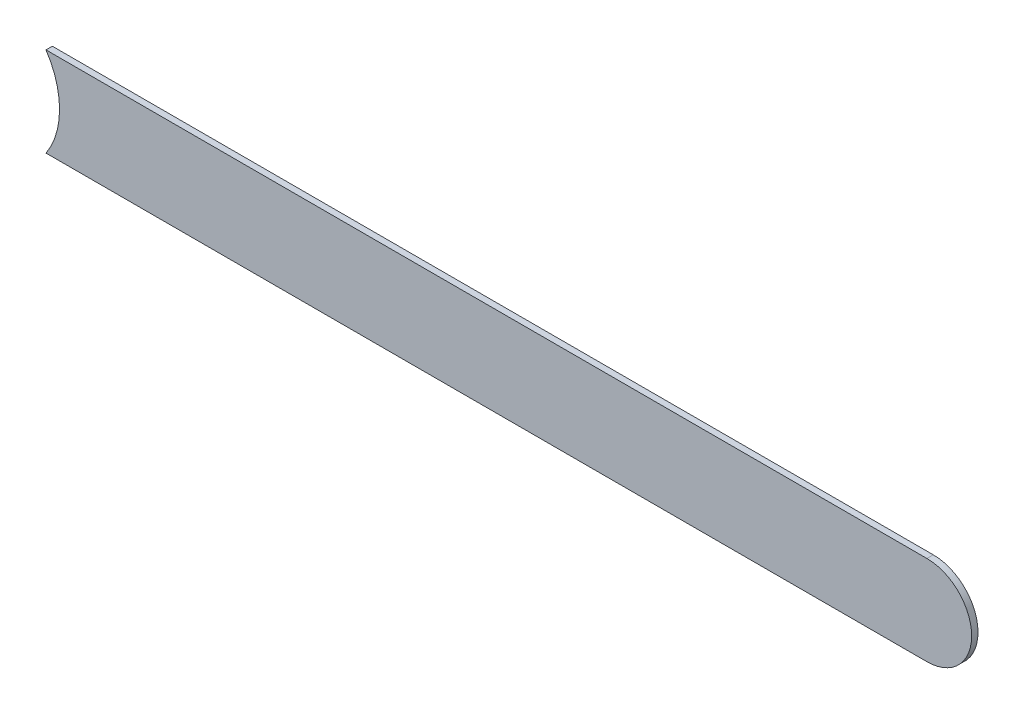
ISO-10303-21;
HEADER;
FILE_DESCRIPTION(('STEP AP214'),'2;1');
FILE_NAME('part.step','',(''),(''),'','','');
FILE_SCHEMA(('AUTOMOTIVE_DESIGN { 1 0 10303 214 1 1 1 1 }'));
ENDSEC;
DATA;
#1=APPLICATION_CONTEXT('core data for automotive mechanical design processes');
#2=APPLICATION_PROTOCOL_DEFINITION('international standard','automotive_design',2000,#1);
#3=PRODUCT_CONTEXT('',#1,'mechanical');
#4=PRODUCT('Part','Part','',(#3));
#5=PRODUCT_RELATED_PRODUCT_CATEGORY('part','',(#4));
#6=PRODUCT_DEFINITION_FORMATION('','',#4);
#7=PRODUCT_DEFINITION_CONTEXT('part definition',#1,'design');
#8=PRODUCT_DEFINITION('design','',#6,#7);
#9=PRODUCT_DEFINITION_SHAPE('','',#8);
#10=(LENGTH_UNIT() NAMED_UNIT(*) SI_UNIT(.MILLI.,.METRE.));
#11=(NAMED_UNIT(*) PLANE_ANGLE_UNIT() SI_UNIT($,.RADIAN.));
#12=(NAMED_UNIT(*) SI_UNIT($,.STERADIAN.) SOLID_ANGLE_UNIT());
#13=UNCERTAINTY_MEASURE_WITH_UNIT(LENGTH_MEASURE(1.E-05),#10,'distance_accuracy_value','');
#14=(GEOMETRIC_REPRESENTATION_CONTEXT(3) GLOBAL_UNCERTAINTY_ASSIGNED_CONTEXT((#13)) GLOBAL_UNIT_ASSIGNED_CONTEXT((#10,
#11,#12)) REPRESENTATION_CONTEXT('',''));
#15=CARTESIAN_POINT('',(0.,0.,0.));
#16=DIRECTION('',(0.,0.,1.));
#17=DIRECTION('',(1.,0.,0.));
#18=AXIS2_PLACEMENT_3D('',#15,#16,#17);
#19=CARTESIAN_POINT('',(51.0251685903459,111.6980113,0.));
#20=DIRECTION('',(0.,1.,0.));
#21=DIRECTION('',(1.,0.,0.));
#22=AXIS2_PLACEMENT_3D('',#19,#20,#21);
#23=PLANE('',#22);
#24=DIRECTION('',(1.,0.,0.));
#25=VECTOR('',#24,1.);
#26=CARTESIAN_POINT('',(50.6510036,111.6980113,0.03556));
#27=LINE('',#26,#25);
#28=CARTESIAN_POINT('',(51.0251685903459,111.6980113,0.03556));
#29=VERTEX_POINT('',#28);
#30=CARTESIAN_POINT('',(55.95198868,111.6980113,0.03556));
#31=VERTEX_POINT('',#30);
#32=EDGE_CURVE('E11',#29,#31,#27,.T.);
#33=ORIENTED_EDGE('',*,*,#32,.F.);
#34=DIRECTION('',(0.,0.,1.));
#35=VECTOR('',#34,1.);
#36=CARTESIAN_POINT('',(51.0251685903459,111.6980113,0.));
#37=LINE('',#36,#35);
#38=CARTESIAN_POINT('',(51.0251685903459,111.6980113,0.));
#39=VERTEX_POINT('',#38);
#40=EDGE_CURVE('E24',#39,#29,#37,.T.);
#41=ORIENTED_EDGE('',*,*,#40,.F.);
#42=DIRECTION('',(1.,0.,0.));
#43=VECTOR('',#42,1.);
#44=CARTESIAN_POINT('',(50.6510036,111.6980113,0.));
#45=LINE('',#44,#43);
#46=CARTESIAN_POINT('',(55.95198868,111.6980113,0.));
#47=VERTEX_POINT('',#46);
#48=EDGE_CURVE('E82',#39,#47,#45,.T.);
#49=ORIENTED_EDGE('',*,*,#48,.T.);
#50=DIRECTION('',(0.,0.,1.));
#51=VECTOR('',#50,1.);
#52=CARTESIAN_POINT('',(55.95198868,111.6980113,0.));
#53=LINE('',#52,#51);
#54=EDGE_CURVE('E37',#47,#31,#53,.T.);
#55=ORIENTED_EDGE('',*,*,#54,.T.);
#56=EDGE_LOOP('',(#33,#41,#49,#55));
#57=FACE_BOUND('',#56,.T.);
#58=ADVANCED_FACE('F17',(#57),#23,.F.);
#59=CARTESIAN_POINT('',(55.95198868,111.9480108,0.));
#60=DIRECTION('',(0.,0.,-1.));
#61=DIRECTION('',(0.,-1.,0.));
#62=AXIS2_PLACEMENT_3D('',#59,#60,#61);
#63=CYLINDRICAL_SURFACE('',#62,0.249999500000001);
#64=CARTESIAN_POINT('',(55.95198868,111.9480108,0.03556));
#65=DIRECTION('',(0.,0.,1.));
#66=DIRECTION('',(0.,-1.,0.));
#67=AXIS2_PLACEMENT_3D('',#64,#65,#66);
#68=CIRCLE('',#67,0.249999500000001);
#69=CARTESIAN_POINT('',(55.95198868,112.1980103,0.03556));
#70=VERTEX_POINT('',#69);
#71=EDGE_CURVE('E97',#31,#70,#68,.T.);
#72=ORIENTED_EDGE('',*,*,#71,.F.);
#73=ORIENTED_EDGE('',*,*,#54,.F.);
#74=CARTESIAN_POINT('',(55.95198868,111.9480108,0.));
#75=DIRECTION('',(0.,0.,1.));
#76=DIRECTION('',(0.,-1.,0.));
#77=AXIS2_PLACEMENT_3D('',#74,#75,#76);
#78=CIRCLE('',#77,0.249999500000001);
#79=CARTESIAN_POINT('',(55.95198868,112.1980103,0.));
#80=VERTEX_POINT('',#79);
#81=EDGE_CURVE('E94',#47,#80,#78,.T.);
#82=ORIENTED_EDGE('',*,*,#81,.T.);
#83=DIRECTION('',(0.,0.,1.));
#84=VECTOR('',#83,1.);
#85=CARTESIAN_POINT('',(55.95198868,112.1980103,0.));
#86=LINE('',#85,#84);
#87=EDGE_CURVE('E92',#80,#70,#86,.T.);
#88=ORIENTED_EDGE('',*,*,#87,.T.);
#89=EDGE_LOOP('',(#72,#73,#82,#88));
#90=FACE_BOUND('',#89,.T.);
#91=ADVANCED_FACE('F103',(#90),#63,.T.);
#92=CARTESIAN_POINT('',(55.95198868,112.1980103,0.));
#93=DIRECTION('',(0.,-1.,0.));
#94=DIRECTION('',(-1.,0.,0.));
#95=AXIS2_PLACEMENT_3D('',#92,#93,#94);
#96=PLANE('',#95);
#97=DIRECTION('',(-1.,0.,0.));
#98=VECTOR('',#97,1.);
#99=CARTESIAN_POINT('',(55.95198868,112.1980103,0.03556));
#100=LINE('',#99,#98);
#101=CARTESIAN_POINT('',(51.0251685903459,112.1980103,0.03556));
#102=VERTEX_POINT('',#101);
#103=EDGE_CURVE('E89',#70,#102,#100,.T.);
#104=ORIENTED_EDGE('',*,*,#103,.F.);
#105=ORIENTED_EDGE('',*,*,#87,.F.);
#106=DIRECTION('',(-1.,0.,0.));
#107=VECTOR('',#106,1.);
#108=CARTESIAN_POINT('',(55.95198868,112.1980103,0.));
#109=LINE('',#108,#107);
#110=CARTESIAN_POINT('',(51.0251685903459,112.1980103,0.));
#111=VERTEX_POINT('',#110);
#112=EDGE_CURVE('E87',#80,#111,#109,.T.);
#113=ORIENTED_EDGE('',*,*,#112,.T.);
#114=DIRECTION('',(0.,0.,1.));
#115=VECTOR('',#114,1.);
#116=CARTESIAN_POINT('',(51.0251685903459,112.1980103,0.));
#117=LINE('',#116,#115);
#118=EDGE_CURVE('E69',#111,#102,#117,.T.);
#119=ORIENTED_EDGE('',*,*,#118,.T.);
#120=EDGE_LOOP('',(#104,#105,#113,#119));
#121=FACE_BOUND('',#120,.T.);
#122=ADVANCED_FACE('F108',(#121),#96,.F.);
#123=CARTESIAN_POINT('',(50.6510036,111.9480108,0.));
#124=DIRECTION('',(0.,0.,-1.));
#125=DIRECTION('',(1.,0.,0.));
#126=AXIS2_PLACEMENT_3D('',#123,#124,#125);
#127=CYLINDRICAL_SURFACE('',#126,0.4499991);
#128=DIRECTION('',(0.,0.,1.));
#129=VECTOR('',#128,1.);
#130=CARTESIAN_POINT('',(51.1010027,111.9480108,0.));
#131=LINE('',#130,#129);
#132=CARTESIAN_POINT('',(51.1010027,111.9480108,0.));
#133=VERTEX_POINT('',#132);
#134=CARTESIAN_POINT('',(51.1010027,111.9480108,0.03556));
#135=VERTEX_POINT('',#134);
#136=EDGE_CURVE('E59',#133,#135,#131,.T.);
#137=ORIENTED_EDGE('',*,*,#136,.T.);
#138=CARTESIAN_POINT('',(50.6510036,111.9480108,0.03556));
#139=DIRECTION('',(0.,0.,1.));
#140=DIRECTION('',(1.,0.,0.));
#141=AXIS2_PLACEMENT_3D('',#138,#139,#140);
#142=CIRCLE('',#141,0.4499991);
#143=EDGE_CURVE('E70',#135,#102,#142,.T.);
#144=ORIENTED_EDGE('',*,*,#143,.T.);
#145=ORIENTED_EDGE('',*,*,#118,.F.);
#146=CARTESIAN_POINT('',(50.6510036,111.9480108,0.));
#147=DIRECTION('',(0.,0.,1.));
#148=DIRECTION('',(1.,0.,0.));
#149=AXIS2_PLACEMENT_3D('',#146,#147,#148);
#150=CIRCLE('',#149,0.4499991);
#151=EDGE_CURVE('E73',#133,#111,#150,.T.);
#152=ORIENTED_EDGE('',*,*,#151,.F.);
#153=EDGE_LOOP('',(#137,#144,#145,#152));
#154=FACE_BOUND('',#153,.T.);
#155=ADVANCED_FACE('F74',(#154),#127,.F.);
#156=CARTESIAN_POINT('',(50.6510036,111.9480108,0.));
#157=DIRECTION('',(0.,0.,-1.));
#158=DIRECTION('',(1.,0.,0.));
#159=AXIS2_PLACEMENT_3D('',#156,#157,#158);
#160=CYLINDRICAL_SURFACE('',#159,0.4499991);
#161=ORIENTED_EDGE('',*,*,#40,.T.);
#162=CARTESIAN_POINT('',(50.6510036,111.9480108,0.03556));
#163=DIRECTION('',(0.,0.,1.));
#164=DIRECTION('',(1.,0.,0.));
#165=AXIS2_PLACEMENT_3D('',#162,#163,#164);
#166=CIRCLE('',#165,0.4499991);
#167=EDGE_CURVE('E65',#29,#135,#166,.T.);
#168=ORIENTED_EDGE('',*,*,#167,.T.);
#169=ORIENTED_EDGE('',*,*,#136,.F.);
#170=EDGE_CURVE('E63',#39,#133,#150,.T.);
#171=ORIENTED_EDGE('',*,*,#170,.F.);
#172=EDGE_LOOP('',(#161,#168,#169,#171));
#173=FACE_BOUND('',#172,.T.);
#174=ADVANCED_FACE('F61',(#173),#160,.F.);
#175=CARTESIAN_POINT('',(50.6510036,111.6980113,0.));
#176=DIRECTION('',(0.,0.,-1.));
#177=DIRECTION('',(-1.,0.,0.));
#178=AXIS2_PLACEMENT_3D('',#175,#176,#177);
#179=PLANE('',#178);
#180=ORIENTED_EDGE('',*,*,#48,.F.);
#181=ORIENTED_EDGE('',*,*,#170,.T.);
#182=ORIENTED_EDGE('',*,*,#151,.T.);
#183=ORIENTED_EDGE('',*,*,#112,.F.);
#184=ORIENTED_EDGE('',*,*,#81,.F.);
#185=EDGE_LOOP('',(#180,#181,#182,#183,#184));
#186=FACE_BOUND('',#185,.T.);
#187=ADVANCED_FACE('F80',(#186),#179,.T.);
#188=CARTESIAN_POINT('',(50.6510036,111.6980113,0.03556));
#189=DIRECTION('',(0.,0.,-1.));
#190=DIRECTION('',(-1.,0.,0.));
#191=AXIS2_PLACEMENT_3D('',#188,#189,#190);
#192=PLANE('',#191);
#193=ORIENTED_EDGE('',*,*,#167,.F.);
#194=ORIENTED_EDGE('',*,*,#32,.T.);
#195=ORIENTED_EDGE('',*,*,#71,.T.);
#196=ORIENTED_EDGE('',*,*,#103,.T.);
#197=ORIENTED_EDGE('',*,*,#143,.F.);
#198=EDGE_LOOP('',(#193,#194,#195,#196,#197));
#199=FACE_BOUND('',#198,.T.);
#200=ADVANCED_FACE('F106',(#199),#192,.F.);
#201=CLOSED_SHELL('',(#58,#91,#122,#155,#174,#187,#200));
#202=MANIFOLD_SOLID_BREP('B1',#201);
#203=ADVANCED_BREP_SHAPE_REPRESENTATION('',(#18,#202),#14);
#204=SHAPE_DEFINITION_REPRESENTATION(#9,#203);
ENDSEC;
END-ISO-10303-21;
